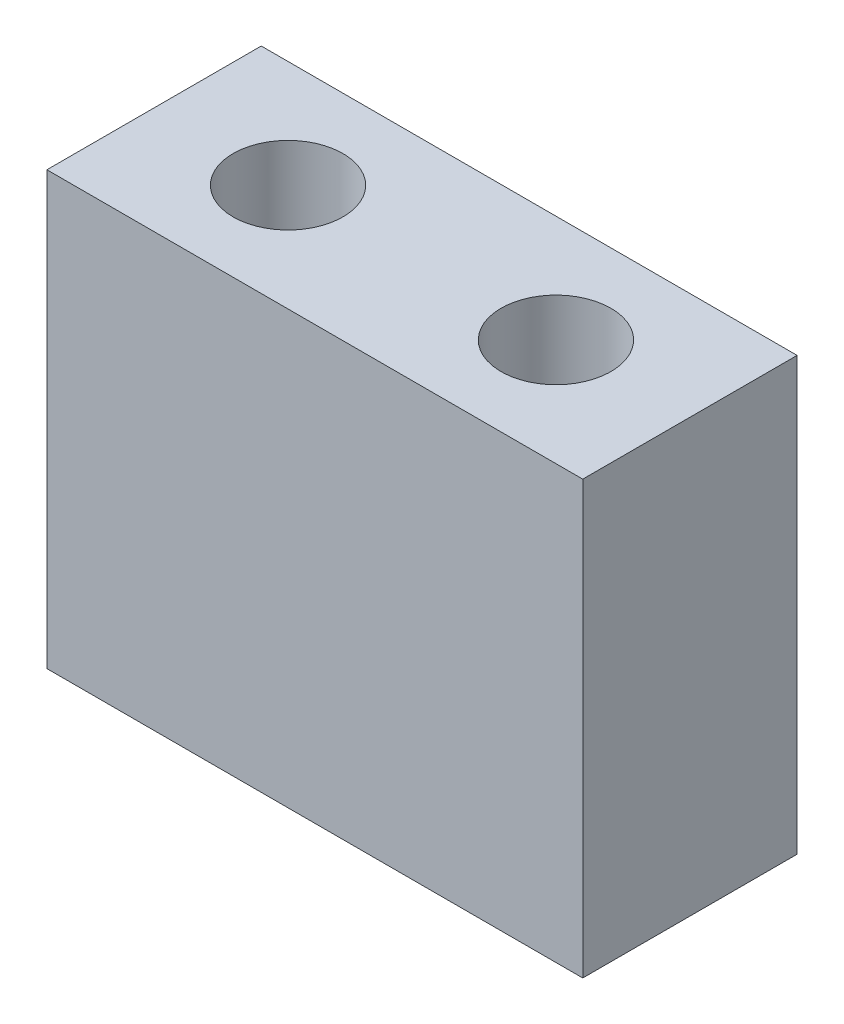
ISO-10303-21;
HEADER;
FILE_DESCRIPTION(('STEP AP214'),'2;1');
FILE_NAME('part.step','',(''),(''),'','','');
FILE_SCHEMA(('AUTOMOTIVE_DESIGN { 1 0 10303 214 1 1 1 1 }'));
ENDSEC;
DATA;
#1=APPLICATION_CONTEXT('core data for automotive mechanical design processes');
#2=APPLICATION_PROTOCOL_DEFINITION('international standard','automotive_design',2000,#1);
#3=PRODUCT_CONTEXT('',#1,'mechanical');
#4=PRODUCT('Part','Part','',(#3));
#5=PRODUCT_RELATED_PRODUCT_CATEGORY('part','',(#4));
#6=PRODUCT_DEFINITION_FORMATION('','',#4);
#7=PRODUCT_DEFINITION_CONTEXT('part definition',#1,'design');
#8=PRODUCT_DEFINITION('design','',#6,#7);
#9=PRODUCT_DEFINITION_SHAPE('','',#8);
#10=(LENGTH_UNIT() NAMED_UNIT(*) SI_UNIT(.MILLI.,.METRE.));
#11=(NAMED_UNIT(*) PLANE_ANGLE_UNIT() SI_UNIT($,.RADIAN.));
#12=(NAMED_UNIT(*) SI_UNIT($,.STERADIAN.) SOLID_ANGLE_UNIT());
#13=UNCERTAINTY_MEASURE_WITH_UNIT(LENGTH_MEASURE(1.E-05),#10,'distance_accuracy_value','');
#14=(GEOMETRIC_REPRESENTATION_CONTEXT(3) GLOBAL_UNCERTAINTY_ASSIGNED_CONTEXT((#13)) GLOBAL_UNIT_ASSIGNED_CONTEXT((#10,
#11,#12)) REPRESENTATION_CONTEXT('',''));
#15=CARTESIAN_POINT('',(0.,0.,0.));
#16=DIRECTION('',(0.,0.,1.));
#17=DIRECTION('',(1.,0.,0.));
#18=AXIS2_PLACEMENT_3D('',#15,#16,#17);
#19=CARTESIAN_POINT('',(10.,16.125,4.));
#20=DIRECTION('',(-1.,0.,0.));
#21=DIRECTION('',(0.,0.,1.));
#22=AXIS2_PLACEMENT_3D('',#19,#20,#21);
#23=PLANE('',#22);
#24=DIRECTION('',(0.,0.,-1.));
#25=VECTOR('',#24,1.);
#26=CARTESIAN_POINT('',(10.,0.,4.));
#27=LINE('',#26,#25);
#28=CARTESIAN_POINT('',(10.,0.,4.));
#29=VERTEX_POINT('',#28);
#30=CARTESIAN_POINT('',(10.,0.,-4.));
#31=VERTEX_POINT('',#30);
#32=EDGE_CURVE('E108',#29,#31,#27,.T.);
#33=ORIENTED_EDGE('',*,*,#32,.T.);
#34=DIRECTION('',(0.,-1.,0.));
#35=VECTOR('',#34,1.);
#36=CARTESIAN_POINT('',(10.,16.125,-4.));
#37=LINE('',#36,#35);
#38=CARTESIAN_POINT('',(10.,16.125,-4.));
#39=VERTEX_POINT('',#38);
#40=EDGE_CURVE('E11',#39,#31,#37,.T.);
#41=ORIENTED_EDGE('',*,*,#40,.F.);
#42=DIRECTION('',(0.,0.,-1.));
#43=VECTOR('',#42,1.);
#44=CARTESIAN_POINT('',(10.,16.125,4.));
#45=LINE('',#44,#43);
#46=CARTESIAN_POINT('',(10.,16.125,4.));
#47=VERTEX_POINT('',#46);
#48=EDGE_CURVE('E96',#47,#39,#45,.T.);
#49=ORIENTED_EDGE('',*,*,#48,.F.);
#50=DIRECTION('',(0.,-1.,0.));
#51=VECTOR('',#50,1.);
#52=CARTESIAN_POINT('',(10.,16.125,4.));
#53=LINE('',#52,#51);
#54=EDGE_CURVE('E104',#47,#29,#53,.T.);
#55=ORIENTED_EDGE('',*,*,#54,.T.);
#56=EDGE_LOOP('',(#33,#41,#49,#55));
#57=FACE_BOUND('',#56,.T.);
#58=ADVANCED_FACE('F45',(#57),#23,.F.);
#59=CARTESIAN_POINT('',(-10.,16.125,-4.));
#60=DIRECTION('',(0.,0.,1.));
#61=DIRECTION('',(1.,0.,0.));
#62=AXIS2_PLACEMENT_3D('',#59,#60,#61);
#63=PLANE('',#62);
#64=DIRECTION('',(-1.,0.,0.));
#65=VECTOR('',#64,1.);
#66=CARTESIAN_POINT('',(-10.,0.,-4.));
#67=LINE('',#66,#65);
#68=CARTESIAN_POINT('',(-10.,0.,-4.));
#69=VERTEX_POINT('',#68);
#70=EDGE_CURVE('E100',#31,#69,#67,.T.);
#71=ORIENTED_EDGE('',*,*,#70,.T.);
#72=DIRECTION('',(0.,-1.,0.));
#73=VECTOR('',#72,1.);
#74=CARTESIAN_POINT('',(-10.,16.125,-4.));
#75=LINE('',#74,#73);
#76=CARTESIAN_POINT('',(-10.,16.125,-4.));
#77=VERTEX_POINT('',#76);
#78=EDGE_CURVE('E53',#77,#69,#75,.T.);
#79=ORIENTED_EDGE('',*,*,#78,.F.);
#80=DIRECTION('',(-1.,0.,0.));
#81=VECTOR('',#80,1.);
#82=CARTESIAN_POINT('',(-10.,16.125,-4.));
#83=LINE('',#82,#81);
#84=EDGE_CURVE('E91',#39,#77,#83,.T.);
#85=ORIENTED_EDGE('',*,*,#84,.F.);
#86=ORIENTED_EDGE('',*,*,#40,.T.);
#87=EDGE_LOOP('',(#71,#79,#85,#86));
#88=FACE_BOUND('',#87,.T.);
#89=ADVANCED_FACE('F99',(#88),#63,.F.);
#90=CARTESIAN_POINT('',(-10.,16.125,4.));
#91=DIRECTION('',(1.,0.,0.));
#92=DIRECTION('',(0.,0.,-1.));
#93=AXIS2_PLACEMENT_3D('',#90,#91,#92);
#94=PLANE('',#93);
#95=DIRECTION('',(0.,0.,1.));
#96=VECTOR('',#95,1.);
#97=CARTESIAN_POINT('',(-10.,0.,4.));
#98=LINE('',#97,#96);
#99=CARTESIAN_POINT('',(-10.,0.,4.));
#100=VERTEX_POINT('',#99);
#101=EDGE_CURVE('E78',#69,#100,#98,.T.);
#102=ORIENTED_EDGE('',*,*,#101,.T.);
#103=DIRECTION('',(0.,-1.,0.));
#104=VECTOR('',#103,1.);
#105=CARTESIAN_POINT('',(-10.,16.125,4.));
#106=LINE('',#105,#104);
#107=CARTESIAN_POINT('',(-10.,16.125,4.));
#108=VERTEX_POINT('',#107);
#109=EDGE_CURVE('E101',#108,#100,#106,.T.);
#110=ORIENTED_EDGE('',*,*,#109,.F.);
#111=DIRECTION('',(0.,0.,1.));
#112=VECTOR('',#111,1.);
#113=CARTESIAN_POINT('',(-10.,16.125,4.));
#114=LINE('',#113,#112);
#115=EDGE_CURVE('E94',#77,#108,#114,.T.);
#116=ORIENTED_EDGE('',*,*,#115,.F.);
#117=ORIENTED_EDGE('',*,*,#78,.T.);
#118=EDGE_LOOP('',(#102,#110,#116,#117));
#119=FACE_BOUND('',#118,.T.);
#120=ADVANCED_FACE('F102',(#119),#94,.F.);
#121=CARTESIAN_POINT('',(-10.,16.125,4.));
#122=DIRECTION('',(0.,0.,-1.));
#123=DIRECTION('',(-1.,0.,0.));
#124=AXIS2_PLACEMENT_3D('',#121,#122,#123);
#125=PLANE('',#124);
#126=DIRECTION('',(1.,0.,0.));
#127=VECTOR('',#126,1.);
#128=CARTESIAN_POINT('',(-10.,0.,4.));
#129=LINE('',#128,#127);
#130=EDGE_CURVE('E84',#100,#29,#129,.T.);
#131=ORIENTED_EDGE('',*,*,#130,.T.);
#132=ORIENTED_EDGE('',*,*,#54,.F.);
#133=DIRECTION('',(1.,0.,0.));
#134=VECTOR('',#133,1.);
#135=CARTESIAN_POINT('',(-10.,16.125,4.));
#136=LINE('',#135,#134);
#137=EDGE_CURVE('E61',#108,#47,#136,.T.);
#138=ORIENTED_EDGE('',*,*,#137,.F.);
#139=ORIENTED_EDGE('',*,*,#109,.T.);
#140=EDGE_LOOP('',(#131,#132,#138,#139));
#141=FACE_BOUND('',#140,.T.);
#142=ADVANCED_FACE('F116',(#141),#125,.F.);
#143=CARTESIAN_POINT('',(0.,16.125,0.));
#144=DIRECTION('',(0.,-1.,0.));
#145=DIRECTION('',(0.,0.,-1.));
#146=AXIS2_PLACEMENT_3D('',#143,#144,#145);
#147=PLANE('',#146);
#148=CARTESIAN_POINT('',(-5.,16.125,0.));
#149=DIRECTION('',(0.,1.,0.));
#150=DIRECTION('',(0.,0.,1.));
#151=AXIS2_PLACEMENT_3D('',#148,#149,#150);
#152=CIRCLE('',#151,2.05);
#153=CARTESIAN_POINT('',(-5.,16.125,2.05));
#154=VERTEX_POINT('',#153);
#155=EDGE_CURVE('E125',#154,#154,#152,.T.);
#156=ORIENTED_EDGE('',*,*,#155,.F.);
#157=EDGE_LOOP('',(#156));
#158=FACE_BOUND('',#157,.T.);
#159=CARTESIAN_POINT('',(5.,16.125,0.));
#160=DIRECTION('',(0.,1.,0.));
#161=DIRECTION('',(0.,0.,-1.));
#162=AXIS2_PLACEMENT_3D('',#159,#160,#161);
#163=CIRCLE('',#162,2.05);
#164=CARTESIAN_POINT('',(5.,16.125,-2.05));
#165=VERTEX_POINT('',#164);
#166=EDGE_CURVE('E122',#165,#165,#163,.T.);
#167=ORIENTED_EDGE('',*,*,#166,.F.);
#168=EDGE_LOOP('',(#167));
#169=FACE_BOUND('',#168,.T.);
#170=ORIENTED_EDGE('',*,*,#48,.T.);
#171=ORIENTED_EDGE('',*,*,#84,.T.);
#172=ORIENTED_EDGE('',*,*,#115,.T.);
#173=ORIENTED_EDGE('',*,*,#137,.T.);
#174=EDGE_LOOP('',(#170,#171,#172,#173));
#175=FACE_BOUND('',#174,.T.);
#176=ADVANCED_FACE('F92',(#158,#169,#175),#147,.F.);
#177=CARTESIAN_POINT('',(0.,0.,0.));
#178=DIRECTION('',(0.,-1.,0.));
#179=DIRECTION('',(0.,0.,-1.));
#180=AXIS2_PLACEMENT_3D('',#177,#178,#179);
#181=PLANE('',#180);
#182=CARTESIAN_POINT('',(-5.,0.,0.));
#183=DIRECTION('',(0.,-1.,0.));
#184=DIRECTION('',(0.,0.,-1.));
#185=AXIS2_PLACEMENT_3D('',#182,#183,#184);
#186=CIRCLE('',#185,2.05);
#187=CARTESIAN_POINT('',(-5.,0.,-2.05));
#188=VERTEX_POINT('',#187);
#189=EDGE_CURVE('E111',#188,#188,#186,.F.);
#190=ORIENTED_EDGE('',*,*,#189,.T.);
#191=EDGE_LOOP('',(#190));
#192=FACE_BOUND('',#191,.T.);
#193=CARTESIAN_POINT('',(5.,0.,0.));
#194=DIRECTION('',(0.,-1.,0.));
#195=DIRECTION('',(0.,0.,-1.));
#196=AXIS2_PLACEMENT_3D('',#193,#194,#195);
#197=CIRCLE('',#196,2.05);
#198=CARTESIAN_POINT('',(5.,0.,-2.05));
#199=VERTEX_POINT('',#198);
#200=EDGE_CURVE('E126',#199,#199,#197,.F.);
#201=ORIENTED_EDGE('',*,*,#200,.T.);
#202=EDGE_LOOP('',(#201));
#203=FACE_BOUND('',#202,.T.);
#204=ORIENTED_EDGE('',*,*,#32,.F.);
#205=ORIENTED_EDGE('',*,*,#130,.F.);
#206=ORIENTED_EDGE('',*,*,#101,.F.);
#207=ORIENTED_EDGE('',*,*,#70,.F.);
#208=EDGE_LOOP('',(#204,#205,#206,#207));
#209=FACE_BOUND('',#208,.T.);
#210=ADVANCED_FACE('F119',(#192,#203,#209),#181,.T.);
#211=CARTESIAN_POINT('',(5.,-5.79827560572969,0.));
#212=DIRECTION('',(0.,1.,0.));
#213=DIRECTION('',(0.,0.,1.));
#214=AXIS2_PLACEMENT_3D('',#211,#212,#213);
#215=CYLINDRICAL_SURFACE('',#214,2.05);
#216=ORIENTED_EDGE('',*,*,#166,.T.);
#217=EDGE_LOOP('',(#216));
#218=FACE_BOUND('',#217,.T.);
#219=ORIENTED_EDGE('',*,*,#200,.F.);
#220=EDGE_LOOP('',(#219));
#221=FACE_BOUND('',#220,.T.);
#222=ADVANCED_FACE('F142',(#218,#221),#215,.F.);
#223=CARTESIAN_POINT('',(-5.,-5.79827560572969,0.));
#224=DIRECTION('',(0.,1.,0.));
#225=DIRECTION('',(0.,0.,1.));
#226=AXIS2_PLACEMENT_3D('',#223,#224,#225);
#227=CYLINDRICAL_SURFACE('',#226,2.05);
#228=ORIENTED_EDGE('',*,*,#155,.T.);
#229=EDGE_LOOP('',(#228));
#230=FACE_BOUND('',#229,.T.);
#231=ORIENTED_EDGE('',*,*,#189,.F.);
#232=EDGE_LOOP('',(#231));
#233=FACE_BOUND('',#232,.T.);
#234=ADVANCED_FACE('F134',(#230,#233),#227,.F.);
#235=CLOSED_SHELL('',(#58,#89,#120,#142,#176,#210,#222,#234));
#236=MANIFOLD_SOLID_BREP('B2',#235);
#237=ADVANCED_BREP_SHAPE_REPRESENTATION('',(#18,#236),#14);
#238=SHAPE_DEFINITION_REPRESENTATION(#9,#237);
ENDSEC;
END-ISO-10303-21;
